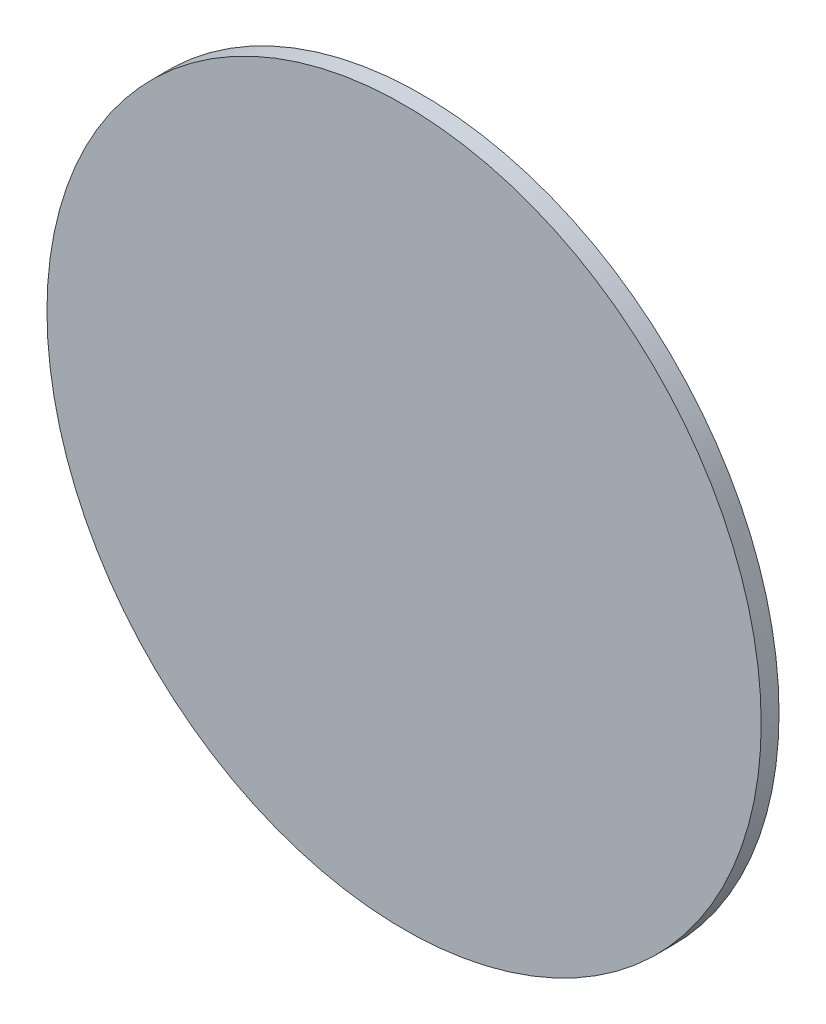
ISO-10303-21;
HEADER;
FILE_DESCRIPTION(('STEP AP214'),'2;1');
FILE_NAME('part.step','',(''),(''),'','','');
FILE_SCHEMA(('AUTOMOTIVE_DESIGN { 1 0 10303 214 1 1 1 1 }'));
ENDSEC;
DATA;
#1=APPLICATION_CONTEXT('core data for automotive mechanical design processes');
#2=APPLICATION_PROTOCOL_DEFINITION('international standard','automotive_design',2000,#1);
#3=PRODUCT_CONTEXT('',#1,'mechanical');
#4=PRODUCT('Part','Part','',(#3));
#5=PRODUCT_RELATED_PRODUCT_CATEGORY('part','',(#4));
#6=PRODUCT_DEFINITION_FORMATION('','',#4);
#7=PRODUCT_DEFINITION_CONTEXT('part definition',#1,'design');
#8=PRODUCT_DEFINITION('design','',#6,#7);
#9=PRODUCT_DEFINITION_SHAPE('','',#8);
#10=(LENGTH_UNIT() NAMED_UNIT(*) SI_UNIT(.MILLI.,.METRE.));
#11=(NAMED_UNIT(*) PLANE_ANGLE_UNIT() SI_UNIT($,.RADIAN.));
#12=(NAMED_UNIT(*) SI_UNIT($,.STERADIAN.) SOLID_ANGLE_UNIT());
#13=UNCERTAINTY_MEASURE_WITH_UNIT(LENGTH_MEASURE(1.E-05),#10,'distance_accuracy_value','');
#14=(GEOMETRIC_REPRESENTATION_CONTEXT(3) GLOBAL_UNCERTAINTY_ASSIGNED_CONTEXT((#13)) GLOBAL_UNIT_ASSIGNED_CONTEXT((#10,
#11,#12)) REPRESENTATION_CONTEXT('',''));
#15=CARTESIAN_POINT('',(0.,0.,0.));
#16=DIRECTION('',(0.,0.,1.));
#17=DIRECTION('',(1.,0.,0.));
#18=AXIS2_PLACEMENT_3D('',#15,#16,#17);
#19=CARTESIAN_POINT('',(0.,0.,4.7625));
#20=DIRECTION('',(0.,0.,-1.));
#21=DIRECTION('',(-1.,0.,0.));
#22=AXIS2_PLACEMENT_3D('',#19,#20,#21);
#23=CYLINDRICAL_SURFACE('',#22,95.25);
#24=CARTESIAN_POINT('',(0.,0.,4.7625));
#25=DIRECTION('',(0.,0.,1.));
#26=DIRECTION('',(1.,0.,0.));
#27=AXIS2_PLACEMENT_3D('',#24,#25,#26);
#28=CIRCLE('',#27,95.25);
#29=CARTESIAN_POINT('',(-95.25,0.,4.7625));
#30=VERTEX_POINT('',#29);
#31=EDGE_CURVE('E10',#30,#30,#28,.T.);
#32=CARTESIAN_POINT('',(0.,0.,0.));
#33=DIRECTION('',(0.,0.,1.));
#34=DIRECTION('',(1.,0.,0.));
#35=AXIS2_PLACEMENT_3D('',#32,#33,#34);
#36=CIRCLE('',#35,95.25);
#37=CARTESIAN_POINT('',(-95.25,0.,0.));
#38=VERTEX_POINT('',#37);
#39=EDGE_CURVE('E33',#38,#38,#36,.T.);
#40=CARTESIAN_POINT('',(-95.25,0.,4.7625));
#41=CARTESIAN_POINT('',(-95.25,0.,4.712890625));
#42=CARTESIAN_POINT('',(-95.25,0.,4.66328125));
#43=CARTESIAN_POINT('',(-95.25,0.,4.5640625));
#44=CARTESIAN_POINT('',(-95.25,0.,4.514453125));
#45=CARTESIAN_POINT('',(-95.25,0.,4.415234375));
#46=CARTESIAN_POINT('',(-95.25,0.,4.365625));
#47=CARTESIAN_POINT('',(-95.25,0.,4.26640625));
#48=CARTESIAN_POINT('',(-95.25,0.,4.216796875));
#49=CARTESIAN_POINT('',(-95.25,0.,4.117578125));
#50=CARTESIAN_POINT('',(-95.25,0.,4.06796875));
#51=CARTESIAN_POINT('',(-95.25,0.,3.96875));
#52=CARTESIAN_POINT('',(-95.25,0.,3.919140625));
#53=CARTESIAN_POINT('',(-95.25,0.,3.819921875));
#54=CARTESIAN_POINT('',(-95.25,0.,3.7703125));
#55=CARTESIAN_POINT('',(-95.25,0.,3.67109375));
#56=CARTESIAN_POINT('',(-95.25,0.,3.621484375));
#57=CARTESIAN_POINT('',(-95.25,0.,3.522265625));
#58=CARTESIAN_POINT('',(-95.25,0.,3.47265625));
#59=CARTESIAN_POINT('',(-95.25,0.,3.3734375));
#60=CARTESIAN_POINT('',(-95.25,0.,3.323828125));
#61=CARTESIAN_POINT('',(-95.25,0.,3.224609375));
#62=CARTESIAN_POINT('',(-95.25,0.,3.175));
#63=CARTESIAN_POINT('',(-95.25,0.,3.07578125));
#64=CARTESIAN_POINT('',(-95.25,0.,3.026171875));
#65=CARTESIAN_POINT('',(-95.25,0.,2.926953125));
#66=CARTESIAN_POINT('',(-95.25,0.,2.87734375));
#67=CARTESIAN_POINT('',(-95.25,0.,2.778125));
#68=CARTESIAN_POINT('',(-95.25,0.,2.728515625));
#69=CARTESIAN_POINT('',(-95.25,0.,2.629296875));
#70=CARTESIAN_POINT('',(-95.25,0.,2.5796875));
#71=CARTESIAN_POINT('',(-95.25,0.,2.48046875));
#72=CARTESIAN_POINT('',(-95.25,0.,2.430859375));
#73=CARTESIAN_POINT('',(-95.25,0.,2.331640625));
#74=CARTESIAN_POINT('',(-95.25,0.,2.28203125));
#75=CARTESIAN_POINT('',(-95.25,0.,2.1828125));
#76=CARTESIAN_POINT('',(-95.25,0.,2.133203125));
#77=CARTESIAN_POINT('',(-95.25,0.,2.033984375));
#78=CARTESIAN_POINT('',(-95.25,0.,1.984375));
#79=CARTESIAN_POINT('',(-95.25,0.,1.88515625));
#80=CARTESIAN_POINT('',(-95.25,0.,1.835546875));
#81=CARTESIAN_POINT('',(-95.25,0.,1.736328125));
#82=CARTESIAN_POINT('',(-95.25,0.,1.68671875));
#83=CARTESIAN_POINT('',(-95.25,0.,1.5875));
#84=CARTESIAN_POINT('',(-95.25,0.,1.537890625));
#85=CARTESIAN_POINT('',(-95.25,0.,1.438671875));
#86=CARTESIAN_POINT('',(-95.25,0.,1.3890625));
#87=CARTESIAN_POINT('',(-95.25,0.,1.28984375));
#88=CARTESIAN_POINT('',(-95.25,0.,1.240234375));
#89=CARTESIAN_POINT('',(-95.25,0.,1.141015625));
#90=CARTESIAN_POINT('',(-95.25,0.,1.09140625));
#91=CARTESIAN_POINT('',(-95.25,0.,0.992187499999999));
#92=CARTESIAN_POINT('',(-95.25,0.,0.942578124999999));
#93=CARTESIAN_POINT('',(-95.25,0.,0.843359375));
#94=CARTESIAN_POINT('',(-95.25,0.,0.79375));
#95=CARTESIAN_POINT('',(-95.25,0.,0.69453125));
#96=CARTESIAN_POINT('',(-95.25,0.,0.644921875));
#97=CARTESIAN_POINT('',(-95.25,0.,0.545703125));
#98=CARTESIAN_POINT('',(-95.25,0.,0.49609375));
#99=CARTESIAN_POINT('',(-95.25,0.,0.396875));
#100=CARTESIAN_POINT('',(-95.25,0.,0.347265625));
#101=CARTESIAN_POINT('',(-95.25,0.,0.248046875));
#102=CARTESIAN_POINT('',(-95.25,0.,0.1984375));
#103=CARTESIAN_POINT('',(-95.25,0.,0.09921875));
#104=CARTESIAN_POINT('',(-95.25,0.,0.049609375));
#105=CARTESIAN_POINT('',(-95.25,0.,0.));
#106=B_SPLINE_CURVE_WITH_KNOTS('',3,(#40,#41,#42,#43,#44,#45,#46,#47,#48,#49,#50,#51,#52,#53,
#54,#55,#56,#57,#58,#59,#60,#61,#62,#63,#64,#65,#66,#67,#68,#69,#70,#71,#72,#73,#74,#75,#76,#77,
#78,#79,#80,#81,#82,#83,#84,#85,#86,#87,#88,#89,#90,#91,#92,#93,#94,#95,#96,#97,#98,#99,#100,
#101,#102,#103,#104,#105),.UNSPECIFIED.,.F.,.F.,(4,2,2,2,2,2,2,2,2,2,2,2,2,2,2,2,2,2,2,2,2,2,2,
2,2,2,2,2,2,2,2,2,4),(0.,0.148828125,0.29765625,0.446484375,0.5953125,0.744140625,
0.892968750000001,1.041796875,1.190625,1.339453125,1.48828125,1.637109375,1.7859375,1.934765625,
2.08359375,2.232421875,2.38125,2.530078125,2.67890625,2.827734375,2.9765625,3.125390625,
3.27421875,3.423046875,3.571875,3.720703125,3.86953125,4.018359375,4.1671875,4.316015625,
4.46484375,4.613671875,4.7625),.UNSPECIFIED.);
#107=EDGE_CURVE('BSEAM30',#30,#38,#106,.T.);
#108=ORIENTED_EDGE('',*,*,#31,.F.);
#109=ORIENTED_EDGE('',*,*,#39,.T.);
#110=ORIENTED_EDGE('',*,*,#107,.T.);
#111=ORIENTED_EDGE('',*,*,#107,.F.);
#112=EDGE_LOOP('',(#108,#110,#109,#111));
#113=FACE_BOUND('',#112,.T.);
#114=ADVANCED_FACE('F30',(#113),#23,.T.);
#115=CARTESIAN_POINT('',(0.,0.,4.7625));
#116=DIRECTION('',(0.,0.,1.));
#117=DIRECTION('',(1.,0.,0.));
#118=AXIS2_PLACEMENT_3D('',#115,#116,#117);
#119=PLANE('',#118);
#120=ORIENTED_EDGE('',*,*,#31,.T.);
#121=EDGE_LOOP('',(#120));
#122=FACE_BOUND('',#121,.T.);
#123=ADVANCED_FACE('F45',(#122),#119,.T.);
#124=CARTESIAN_POINT('',(0.,0.,0.));
#125=DIRECTION('',(0.,0.,1.));
#126=DIRECTION('',(1.,0.,0.));
#127=AXIS2_PLACEMENT_3D('',#124,#125,#126);
#128=PLANE('',#127);
#129=ORIENTED_EDGE('',*,*,#39,.F.);
#130=EDGE_LOOP('',(#129));
#131=FACE_BOUND('',#130,.T.);
#132=ADVANCED_FACE('F43',(#131),#128,.F.);
#133=CLOSED_SHELL('',(#114,#123,#132));
#134=MANIFOLD_SOLID_BREP('B2',#133);
#135=ADVANCED_BREP_SHAPE_REPRESENTATION('',(#18,#134),#14);
#136=SHAPE_DEFINITION_REPRESENTATION(#9,#135);
ENDSEC;
END-ISO-10303-21;
